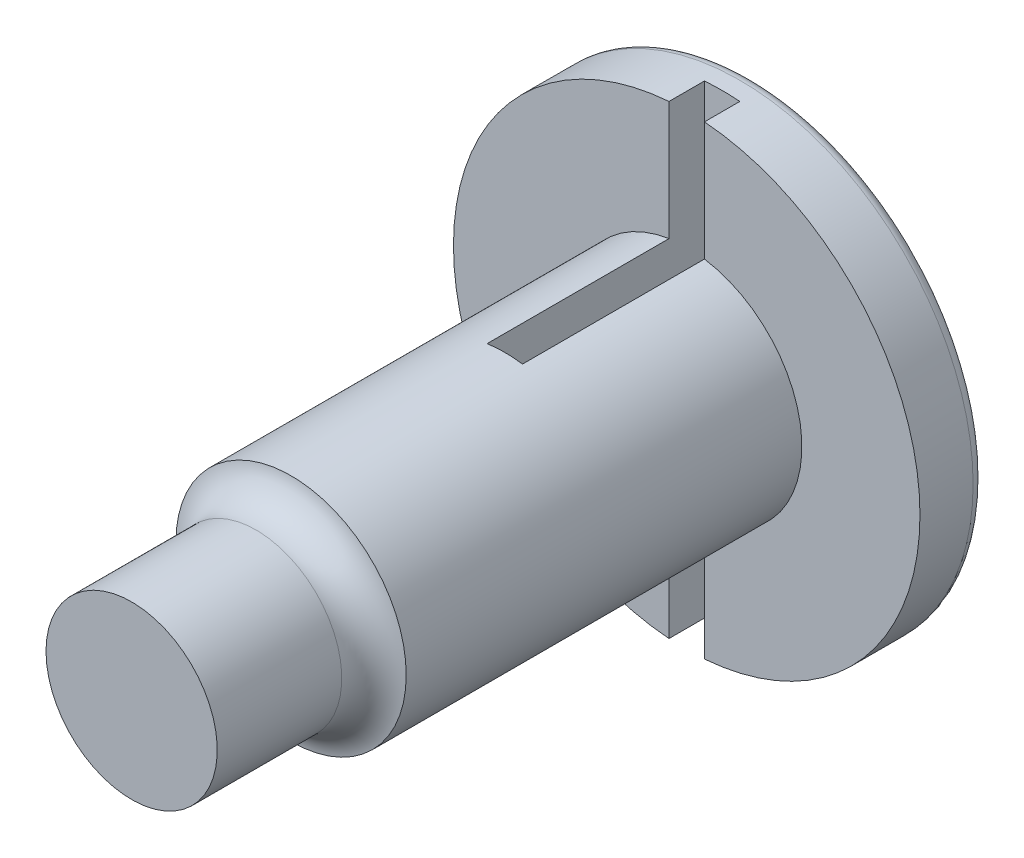
ISO-10303-21;
HEADER;
FILE_DESCRIPTION(('STEP AP214'),'2;1');
FILE_NAME('part.step','',(''),(''),'','','');
FILE_SCHEMA(('AUTOMOTIVE_DESIGN { 1 0 10303 214 1 1 1 1 }'));
ENDSEC;
DATA;
#1=APPLICATION_CONTEXT('core data for automotive mechanical design processes');
#2=APPLICATION_PROTOCOL_DEFINITION('international standard','automotive_design',2000,#1);
#3=PRODUCT_CONTEXT('',#1,'mechanical');
#4=PRODUCT('Part','Part','',(#3));
#5=PRODUCT_RELATED_PRODUCT_CATEGORY('part','',(#4));
#6=PRODUCT_DEFINITION_FORMATION('','',#4);
#7=PRODUCT_DEFINITION_CONTEXT('part definition',#1,'design');
#8=PRODUCT_DEFINITION('design','',#6,#7);
#9=PRODUCT_DEFINITION_SHAPE('','',#8);
#10=(LENGTH_UNIT() NAMED_UNIT(*) SI_UNIT(.MILLI.,.METRE.));
#11=(NAMED_UNIT(*) PLANE_ANGLE_UNIT() SI_UNIT($,.RADIAN.));
#12=(NAMED_UNIT(*) SI_UNIT($,.STERADIAN.) SOLID_ANGLE_UNIT());
#13=UNCERTAINTY_MEASURE_WITH_UNIT(LENGTH_MEASURE(1.E-05),#10,'distance_accuracy_value','');
#14=(GEOMETRIC_REPRESENTATION_CONTEXT(3) GLOBAL_UNCERTAINTY_ASSIGNED_CONTEXT((#13)) GLOBAL_UNIT_ASSIGNED_CONTEXT((#10,
#11,#12)) REPRESENTATION_CONTEXT('',''));
#15=CARTESIAN_POINT('',(0.,0.,0.));
#16=DIRECTION('',(0.,0.,1.));
#17=DIRECTION('',(1.,0.,0.));
#18=AXIS2_PLACEMENT_3D('',#15,#16,#17);
#19=CARTESIAN_POINT('',(15.,-197.5,-30.));
#20=DIRECTION('',(1.,0.,0.));
#21=DIRECTION('',(0.,0.,-1.));
#22=AXIS2_PLACEMENT_3D('',#19,#20,#21);
#23=PLANE('',#22);
#24=DIRECTION('',(0.,1.,0.));
#25=VECTOR('',#24,1.);
#26=CARTESIAN_POINT('',(15.,-197.5,-30.));
#27=LINE('',#26,#25);
#28=CARTESIAN_POINT('',(15.,55.5090082779363,-30.));
#29=VERTEX_POINT('',#28);
#30=CARTESIAN_POINT('',(15.,196.92955593308,-30.));
#31=VERTEX_POINT('',#30);
#32=EDGE_CURVE('E139',#29,#31,#27,.T.);
#33=ORIENTED_EDGE('',*,*,#32,.F.);
#34=DIRECTION('',(0.,0.,1.));
#35=VECTOR('',#34,1.);
#36=CARTESIAN_POINT('',(15.,55.5090082779363,-285.));
#37=LINE('',#36,#35);
#38=CARTESIAN_POINT('',(15.,55.5090082779361,152.312875344914));
#39=VERTEX_POINT('',#38);
#40=EDGE_CURVE('E124',#29,#39,#37,.T.);
#41=ORIENTED_EDGE('',*,*,#40,.T.);
#42=DIRECTION('',(0.,-0.999133073092352,-0.0416305447121813));
#43=VECTOR('',#42,1.);
#44=CARTESIAN_POINT('',(15.,-273.,138.625));
#45=LINE('',#44,#43);
#46=CARTESIAN_POINT('',(15.,96.3392443399885,154.014135180833));
#47=VERTEX_POINT('',#46);
#48=EDGE_CURVE('E136',#47,#39,#45,.T.);
#49=ORIENTED_EDGE('',*,*,#48,.F.);
#50=DIRECTION('',(0.,0.,-1.));
#51=VECTOR('',#50,1.);
#52=CARTESIAN_POINT('',(15.,96.3392443399885,335.));
#53=LINE('',#52,#51);
#54=CARTESIAN_POINT('',(15.,96.3392443399885,0.));
#55=VERTEX_POINT('',#54);
#56=EDGE_CURVE('E155',#55,#47,#53,.F.);
#57=ORIENTED_EDGE('',*,*,#56,.F.);
#58=DIRECTION('',(0.,1.,0.));
#59=VECTOR('',#58,1.);
#60=CARTESIAN_POINT('',(15.,-197.5,0.));
#61=LINE('',#60,#59);
#62=CARTESIAN_POINT('',(15.,196.92955593308,0.));
#63=VERTEX_POINT('',#62);
#64=EDGE_CURVE('E170',#55,#63,#61,.T.);
#65=ORIENTED_EDGE('',*,*,#64,.T.);
#66=DIRECTION('',(0.,0.,1.));
#67=VECTOR('',#66,1.);
#68=CARTESIAN_POINT('',(15.,196.92955593308,-55.));
#69=LINE('',#68,#67);
#70=EDGE_CURVE('E179',#63,#31,#69,.F.);
#71=ORIENTED_EDGE('',*,*,#70,.T.);
#72=EDGE_LOOP('',(#33,#41,#49,#57,#65,#71));
#73=FACE_BOUND('',#72,.T.);
#74=ADVANCED_FACE('F35',(#73),#23,.F.);
#75=CARTESIAN_POINT('',(-15.,197.5,-30.));
#76=DIRECTION('',(-1.,0.,0.));
#77=DIRECTION('',(0.,0.,1.));
#78=AXIS2_PLACEMENT_3D('',#75,#76,#77);
#79=PLANE('',#78);
#80=DIRECTION('',(0.,-1.,0.));
#81=VECTOR('',#80,1.);
#82=CARTESIAN_POINT('',(-15.,197.5,-30.));
#83=LINE('',#82,#81);
#84=CARTESIAN_POINT('',(-15.,-55.5090082779363,-30.));
#85=VERTEX_POINT('',#84);
#86=CARTESIAN_POINT('',(-15.,-196.92955593308,-30.));
#87=VERTEX_POINT('',#86);
#88=EDGE_CURVE('E163',#85,#87,#83,.T.);
#89=ORIENTED_EDGE('',*,*,#88,.F.);
#90=DIRECTION('',(0.,0.,1.));
#91=VECTOR('',#90,1.);
#92=CARTESIAN_POINT('',(-15.,-55.5090082779363,-285.));
#93=LINE('',#92,#91);
#94=CARTESIAN_POINT('',(-15.,-55.5090082779365,147.687124655086));
#95=VERTEX_POINT('',#94);
#96=EDGE_CURVE('E254',#85,#95,#93,.T.);
#97=ORIENTED_EDGE('',*,*,#96,.T.);
#98=DIRECTION('',(0.,-0.999133073092352,-0.0416305447121813));
#99=VECTOR('',#98,1.);
#100=CARTESIAN_POINT('',(-15.,-273.,138.625));
#101=LINE('',#100,#99);
#102=CARTESIAN_POINT('',(-15.,-96.3392443399885,145.985864819167));
#103=VERTEX_POINT('',#102);
#104=EDGE_CURVE('E251',#95,#103,#101,.T.);
#105=ORIENTED_EDGE('',*,*,#104,.T.);
#106=DIRECTION('',(0.,0.,-1.));
#107=VECTOR('',#106,1.);
#108=CARTESIAN_POINT('',(-15.,-96.3392443399885,335.));
#109=LINE('',#108,#107);
#110=CARTESIAN_POINT('',(-15.,-96.3392443399885,0.));
#111=VERTEX_POINT('',#110);
#112=EDGE_CURVE('E148',#103,#111,#109,.T.);
#113=ORIENTED_EDGE('',*,*,#112,.T.);
#114=DIRECTION('',(0.,-1.,0.));
#115=VECTOR('',#114,1.);
#116=CARTESIAN_POINT('',(-15.,197.5,0.));
#117=LINE('',#116,#115);
#118=CARTESIAN_POINT('',(-15.,-196.92955593308,0.));
#119=VERTEX_POINT('',#118);
#120=EDGE_CURVE('E159',#111,#119,#117,.T.);
#121=ORIENTED_EDGE('',*,*,#120,.T.);
#122=DIRECTION('',(0.,0.,1.));
#123=VECTOR('',#122,1.);
#124=CARTESIAN_POINT('',(-15.,-196.92955593308,-55.));
#125=LINE('',#124,#123);
#126=EDGE_CURVE('E174',#119,#87,#125,.F.);
#127=ORIENTED_EDGE('',*,*,#126,.T.);
#128=EDGE_LOOP('',(#89,#97,#105,#113,#121,#127));
#129=FACE_BOUND('',#128,.T.);
#130=ADVANCED_FACE('F218',(#129),#79,.F.);
#131=CARTESIAN_POINT('',(0.,0.,-30.));
#132=DIRECTION('',(0.,0.,1.));
#133=DIRECTION('',(1.,0.,0.));
#134=AXIS2_PLACEMENT_3D('',#131,#132,#133);
#135=PLANE('',#134);
#136=CARTESIAN_POINT('',(0.,0.,-30.));
#137=DIRECTION('',(0.,0.,1.));
#138=DIRECTION('',(1.,0.,0.));
#139=AXIS2_PLACEMENT_3D('',#136,#137,#138);
#140=CIRCLE('',#139,57.5);
#141=CARTESIAN_POINT('',(-15.,55.5090082779363,-30.));
#142=VERTEX_POINT('',#141);
#143=EDGE_CURVE('E140',#29,#142,#140,.T.);
#144=ORIENTED_EDGE('',*,*,#143,.F.);
#145=ORIENTED_EDGE('',*,*,#32,.T.);
#146=CARTESIAN_POINT('',(0.,0.,-30.));
#147=DIRECTION('',(0.,0.,1.));
#148=DIRECTION('',(1.,0.,0.));
#149=AXIS2_PLACEMENT_3D('',#146,#147,#148);
#150=CIRCLE('',#149,197.5);
#151=CARTESIAN_POINT('',(-15.,196.92955593308,-30.));
#152=VERTEX_POINT('',#151);
#153=EDGE_CURVE('E195',#152,#31,#150,.F.);
#154=ORIENTED_EDGE('',*,*,#153,.F.);
#155=EDGE_CURVE('E160',#152,#142,#83,.T.);
#156=ORIENTED_EDGE('',*,*,#155,.T.);
#157=EDGE_LOOP('',(#144,#145,#154,#156));
#158=FACE_BOUND('',#157,.T.);
#159=ADVANCED_FACE('F224',(#158),#135,.T.);
#160=CARTESIAN_POINT('',(15.,-273.,138.625));
#161=DIRECTION('',(0.,0.0416305447121813,-0.999133073092352));
#162=DIRECTION('',(0.,0.999133073092352,0.0416305447121813));
#163=AXIS2_PLACEMENT_3D('',#160,#161,#162);
#164=PLANE('',#163);
#165=CARTESIAN_POINT('',(0.,0.,150.));
#166=DIRECTION('',(0.,0.0416305447121813,-0.999133073092352));
#167=DIRECTION('',(0.,0.999133073092352,0.0416305447121813));
#168=AXIS2_PLACEMENT_3D('',#165,#166,#167);
#169=ELLIPSE('',#168,57.5498915495165,57.5);
#170=CARTESIAN_POINT('',(15.,-55.5090082779365,147.687124655086));
#171=VERTEX_POINT('',#170);
#172=EDGE_CURVE('E130',#171,#95,#169,.T.);
#173=ORIENTED_EDGE('',*,*,#172,.F.);
#174=CARTESIAN_POINT('',(15.,-96.3392443399885,145.985864819167));
#175=VERTEX_POINT('',#174);
#176=EDGE_CURVE('E146',#171,#175,#45,.T.);
#177=ORIENTED_EDGE('',*,*,#176,.T.);
#178=CARTESIAN_POINT('',(0.,0.,150.));
#179=DIRECTION('',(0.,0.0416305447121813,-0.999133073092352));
#180=DIRECTION('',(0.,-0.999133073092352,-0.0416305447121813));
#181=AXIS2_PLACEMENT_3D('',#178,#179,#180);
#182=ELLIPSE('',#181,97.5845987143976,97.5);
#183=EDGE_CURVE('E131',#175,#103,#182,.T.);
#184=ORIENTED_EDGE('',*,*,#183,.T.);
#185=ORIENTED_EDGE('',*,*,#104,.F.);
#186=EDGE_LOOP('',(#173,#177,#184,#185));
#187=FACE_BOUND('',#186,.T.);
#188=ADVANCED_FACE('F248',(#187),#164,.T.);
#189=CARTESIAN_POINT('',(0.,0.,0.));
#190=DIRECTION('',(0.,0.,1.));
#191=DIRECTION('',(1.,0.,0.));
#192=AXIS2_PLACEMENT_3D('',#189,#190,#191);
#193=PLANE('',#192);
#194=CARTESIAN_POINT('',(15.,-196.92955593308,0.));
#195=VERTEX_POINT('',#194);
#196=CARTESIAN_POINT('',(15.,-96.3392443399885,0.));
#197=VERTEX_POINT('',#196);
#198=EDGE_CURVE('E172',#195,#197,#61,.T.);
#199=ORIENTED_EDGE('',*,*,#198,.F.);
#200=CARTESIAN_POINT('',(0.,0.,0.));
#201=DIRECTION('',(0.,0.,1.));
#202=DIRECTION('',(1.,0.,0.));
#203=AXIS2_PLACEMENT_3D('',#200,#201,#202);
#204=CIRCLE('',#203,197.5);
#205=EDGE_CURVE('E187',#195,#63,#204,.T.);
#206=ORIENTED_EDGE('',*,*,#205,.T.);
#207=ORIENTED_EDGE('',*,*,#64,.F.);
#208=CARTESIAN_POINT('',(0.,0.,0.));
#209=DIRECTION('',(0.,0.,1.));
#210=DIRECTION('',(1.,0.,0.));
#211=AXIS2_PLACEMENT_3D('',#208,#209,#210);
#212=CIRCLE('',#211,97.5);
#213=EDGE_CURVE('E188',#197,#55,#212,.T.);
#214=ORIENTED_EDGE('',*,*,#213,.F.);
#215=EDGE_LOOP('',(#199,#206,#207,#214));
#216=FACE_BOUND('',#215,.T.);
#217=ADVANCED_FACE('F274',(#216),#193,.T.);
#218=CARTESIAN_POINT('',(0.,0.,-55.));
#219=DIRECTION('',(0.,0.,1.));
#220=DIRECTION('',(1.,0.,0.));
#221=AXIS2_PLACEMENT_3D('',#218,#219,#220);
#222=CYLINDRICAL_SURFACE('',#221,197.5);
#223=CARTESIAN_POINT('',(0.,0.,-45.));
#224=DIRECTION('',(0.,0.,1.));
#225=DIRECTION('',(1.,0.,0.));
#226=AXIS2_PLACEMENT_3D('',#223,#224,#225);
#227=CIRCLE('',#226,197.5);
#228=CARTESIAN_POINT('',(197.5,0.,-45.));
#229=VERTEX_POINT('',#228);
#230=EDGE_CURVE('E43',#229,#229,#227,.T.);
#231=ORIENTED_EDGE('',*,*,#230,.T.);
#232=EDGE_LOOP('',(#231));
#233=FACE_BOUND('',#232,.T.);
#234=DIRECTION('',(0.,0.,1.));
#235=VECTOR('',#234,1.);
#236=CARTESIAN_POINT('',(15.,-196.92955593308,-55.));
#237=LINE('',#236,#235);
#238=CARTESIAN_POINT('',(15.,-196.92955593308,-30.));
#239=VERTEX_POINT('',#238);
#240=EDGE_CURVE('E177',#239,#195,#237,.T.);
#241=ORIENTED_EDGE('',*,*,#240,.F.);
#242=EDGE_CURVE('E198',#239,#87,#150,.F.);
#243=ORIENTED_EDGE('',*,*,#242,.T.);
#244=ORIENTED_EDGE('',*,*,#126,.F.);
#245=CARTESIAN_POINT('',(-15.,196.92955593308,0.));
#246=VERTEX_POINT('',#245);
#247=EDGE_CURVE('E192',#246,#119,#204,.T.);
#248=ORIENTED_EDGE('',*,*,#247,.F.);
#249=DIRECTION('',(0.,0.,1.));
#250=VECTOR('',#249,1.);
#251=CARTESIAN_POINT('',(-15.,196.92955593308,-55.));
#252=LINE('',#251,#250);
#253=EDGE_CURVE('E167',#152,#246,#252,.T.);
#254=ORIENTED_EDGE('',*,*,#253,.F.);
#255=ORIENTED_EDGE('',*,*,#153,.T.);
#256=ORIENTED_EDGE('',*,*,#70,.F.);
#257=ORIENTED_EDGE('',*,*,#205,.F.);
#258=EDGE_LOOP('',(#241,#243,#244,#248,#254,#255,#256,#257));
#259=FACE_BOUND('',#258,.T.);
#260=ADVANCED_FACE('F205',(#233,#259),#222,.T.);
#261=CARTESIAN_POINT('',(0.,0.,-55.));
#262=DIRECTION('',(0.,0.,1.));
#263=DIRECTION('',(1.,0.,0.));
#264=AXIS2_PLACEMENT_3D('',#261,#262,#263);
#265=PLANE('',#264);
#266=CARTESIAN_POINT('',(0.,0.,-55.));
#267=DIRECTION('',(0.,0.,1.));
#268=DIRECTION('',(1.,0.,0.));
#269=AXIS2_PLACEMENT_3D('',#266,#267,#268);
#270=CIRCLE('',#269,187.5);
#271=CARTESIAN_POINT('',(187.5,0.,-55.));
#272=VERTEX_POINT('',#271);
#273=EDGE_CURVE('E11',#272,#272,#270,.F.);
#274=ORIENTED_EDGE('',*,*,#273,.T.);
#275=EDGE_LOOP('',(#274));
#276=FACE_BOUND('',#275,.T.);
#277=CARTESIAN_POINT('',(0.,0.,-55.));
#278=DIRECTION('',(0.,0.,1.));
#279=DIRECTION('',(1.,0.,0.));
#280=AXIS2_PLACEMENT_3D('',#277,#278,#279);
#281=CIRCLE('',#280,57.5);
#282=CARTESIAN_POINT('',(57.5,0.,-55.));
#283=VERTEX_POINT('',#282);
#284=EDGE_CURVE('E261',#283,#283,#281,.T.);
#285=ORIENTED_EDGE('',*,*,#284,.T.);
#286=EDGE_LOOP('',(#285));
#287=FACE_BOUND('',#286,.T.);
#288=ADVANCED_FACE('F333',(#276,#287),#265,.F.);
#289=CARTESIAN_POINT('',(-15.,96.3392443399885,0.));
#290=VERTEX_POINT('',#289);
#291=EDGE_CURVE('E169',#246,#290,#117,.T.);
#292=ORIENTED_EDGE('',*,*,#291,.F.);
#293=ORIENTED_EDGE('',*,*,#247,.T.);
#294=ORIENTED_EDGE('',*,*,#120,.F.);
#295=EDGE_CURVE('E191',#290,#111,#212,.T.);
#296=ORIENTED_EDGE('',*,*,#295,.F.);
#297=EDGE_LOOP('',(#292,#293,#294,#296));
#298=FACE_BOUND('',#297,.T.);
#299=ADVANCED_FACE('F284',(#298),#193,.T.);
#300=CARTESIAN_POINT('',(0.,0.,335.));
#301=DIRECTION('',(0.,0.,-1.));
#302=DIRECTION('',(-1.,0.,0.));
#303=AXIS2_PLACEMENT_3D('',#300,#301,#302);
#304=CYLINDRICAL_SURFACE('',#303,97.5);
#305=CARTESIAN_POINT('',(0.,0.,335.));
#306=DIRECTION('',(0.,0.,1.));
#307=DIRECTION('',(1.,0.,0.));
#308=AXIS2_PLACEMENT_3D('',#305,#306,#307);
#309=CIRCLE('',#308,97.5);
#310=CARTESIAN_POINT('',(97.5,0.,335.));
#311=VERTEX_POINT('',#310);
#312=EDGE_CURVE('E184',#311,#311,#309,.T.);
#313=ORIENTED_EDGE('',*,*,#312,.F.);
#314=EDGE_LOOP('',(#313));
#315=FACE_BOUND('',#314,.T.);
#316=ORIENTED_EDGE('',*,*,#183,.F.);
#317=DIRECTION('',(0.,0.,-1.));
#318=VECTOR('',#317,1.);
#319=CARTESIAN_POINT('',(15.,-96.3392443399885,335.));
#320=LINE('',#319,#318);
#321=EDGE_CURVE('E157',#175,#197,#320,.T.);
#322=ORIENTED_EDGE('',*,*,#321,.T.);
#323=ORIENTED_EDGE('',*,*,#213,.T.);
#324=ORIENTED_EDGE('',*,*,#56,.T.);
#325=CARTESIAN_POINT('',(-15.,96.3392443399885,154.014135180833));
#326=VERTEX_POINT('',#325);
#327=EDGE_CURVE('E144',#326,#47,#182,.T.);
#328=ORIENTED_EDGE('',*,*,#327,.F.);
#329=DIRECTION('',(0.,0.,-1.));
#330=VECTOR('',#329,1.);
#331=CARTESIAN_POINT('',(-15.,96.3392443399885,335.));
#332=LINE('',#331,#330);
#333=EDGE_CURVE('E145',#290,#326,#332,.F.);
#334=ORIENTED_EDGE('',*,*,#333,.F.);
#335=ORIENTED_EDGE('',*,*,#295,.T.);
#336=ORIENTED_EDGE('',*,*,#112,.F.);
#337=EDGE_LOOP('',(#316,#322,#323,#324,#328,#334,#335,#336));
#338=FACE_BOUND('',#337,.T.);
#339=ADVANCED_FACE('F277',(#315,#338),#304,.T.);
#340=CARTESIAN_POINT('',(0.,0.,470.));
#341=DIRECTION('',(0.,0.,-1.));
#342=DIRECTION('',(-1.,0.,0.));
#343=AXIS2_PLACEMENT_3D('',#340,#341,#342);
#344=CYLINDRICAL_SURFACE('',#343,72.5);
#345=CARTESIAN_POINT('',(0.,0.,364.580398915498));
#346=DIRECTION('',(0.,0.,-1.));
#347=DIRECTION('',(-1.,0.,0.));
#348=AXIS2_PLACEMENT_3D('',#345,#346,#347);
#349=CIRCLE('',#348,72.5);
#350=CARTESIAN_POINT('',(-72.5,0.,364.580398915498));
#351=VERTEX_POINT('',#350);
#352=EDGE_CURVE('E200',#351,#351,#349,.F.);
#353=CARTESIAN_POINT('',(0.,0.,470.));
#354=DIRECTION('',(0.,0.,1.));
#355=DIRECTION('',(1.,0.,0.));
#356=AXIS2_PLACEMENT_3D('',#353,#354,#355);
#357=CIRCLE('',#356,72.5);
#358=CARTESIAN_POINT('',(-72.5,0.,470.));
#359=VERTEX_POINT('',#358);
#360=EDGE_CURVE('E181',#359,#359,#357,.T.);
#361=CARTESIAN_POINT('',(-72.5,0.,364.580398915498));
#362=CARTESIAN_POINT('',(-72.5,0.,365.678519760128));
#363=CARTESIAN_POINT('',(-72.5,0.,366.776640604758));
#364=CARTESIAN_POINT('',(-72.5,0.,368.972882294019));
#365=CARTESIAN_POINT('',(-72.5,0.,370.071003138649));
#366=CARTESIAN_POINT('',(-72.5,0.,372.26724482791));
#367=CARTESIAN_POINT('',(-72.5,0.,373.36536567254));
#368=CARTESIAN_POINT('',(-72.5,0.,375.5616073618));
#369=CARTESIAN_POINT('',(-72.5,0.,376.659728206431));
#370=CARTESIAN_POINT('',(-72.5,0.,378.855969895691));
#371=CARTESIAN_POINT('',(-72.5,0.,379.954090740321));
#372=CARTESIAN_POINT('',(-72.5,0.,382.150332429582));
#373=CARTESIAN_POINT('',(-72.5,0.,383.248453274212));
#374=CARTESIAN_POINT('',(-72.5,0.,385.444694963472));
#375=CARTESIAN_POINT('',(-72.5,0.,386.542815808103));
#376=CARTESIAN_POINT('',(-72.5,0.,388.739057497363));
#377=CARTESIAN_POINT('',(-72.5,0.,389.837178341993));
#378=CARTESIAN_POINT('',(-72.5,0.,392.033420031254));
#379=CARTESIAN_POINT('',(-72.5,0.,393.131540875884));
#380=CARTESIAN_POINT('',(-72.5,0.,395.327782565144));
#381=CARTESIAN_POINT('',(-72.5,0.,396.425903409775));
#382=CARTESIAN_POINT('',(-72.5,0.,398.622145099035));
#383=CARTESIAN_POINT('',(-72.5,0.,399.720265943665));
#384=CARTESIAN_POINT('',(-72.5,0.,401.916507632926));
#385=CARTESIAN_POINT('',(-72.5,0.,403.014628477556));
#386=CARTESIAN_POINT('',(-72.5,0.,405.210870166817));
#387=CARTESIAN_POINT('',(-72.5,0.,406.308991011447));
#388=CARTESIAN_POINT('',(-72.5,0.,408.505232700707));
#389=CARTESIAN_POINT('',(-72.5,0.,409.603353545337));
#390=CARTESIAN_POINT('',(-72.5,0.,411.799595234598));
#391=CARTESIAN_POINT('',(-72.5,0.,412.897716079228));
#392=CARTESIAN_POINT('',(-72.5,0.,415.093957768489));
#393=CARTESIAN_POINT('',(-72.5,0.,416.192078613119));
#394=CARTESIAN_POINT('',(-72.5,0.,418.388320302379));
#395=CARTESIAN_POINT('',(-72.5,0.,419.486441147009));
#396=CARTESIAN_POINT('',(-72.5,0.,421.68268283627));
#397=CARTESIAN_POINT('',(-72.5,0.,422.7808036809));
#398=CARTESIAN_POINT('',(-72.5,0.,424.977045370161));
#399=CARTESIAN_POINT('',(-72.5,0.,426.075166214791));
#400=CARTESIAN_POINT('',(-72.5,0.,428.271407904051));
#401=CARTESIAN_POINT('',(-72.5,0.,429.369528748681));
#402=CARTESIAN_POINT('',(-72.5,0.,431.565770437942));
#403=CARTESIAN_POINT('',(-72.5,0.,432.663891282572));
#404=CARTESIAN_POINT('',(-72.5,0.,434.860132971833));
#405=CARTESIAN_POINT('',(-72.5,0.,435.958253816463));
#406=CARTESIAN_POINT('',(-72.5,0.,438.154495505723));
#407=CARTESIAN_POINT('',(-72.5,0.,439.252616350354));
#408=CARTESIAN_POINT('',(-72.5,0.,441.448858039614));
#409=CARTESIAN_POINT('',(-72.5,0.,442.546978884244));
#410=CARTESIAN_POINT('',(-72.5,0.,444.743220573505));
#411=CARTESIAN_POINT('',(-72.5,0.,445.841341418135));
#412=CARTESIAN_POINT('',(-72.5,0.,448.037583107395));
#413=CARTESIAN_POINT('',(-72.5,0.,449.135703952026));
#414=CARTESIAN_POINT('',(-72.5,0.,451.331945641286));
#415=CARTESIAN_POINT('',(-72.5,0.,452.430066485916));
#416=CARTESIAN_POINT('',(-72.5,0.,454.626308175177));
#417=CARTESIAN_POINT('',(-72.5,0.,455.724429019807));
#418=CARTESIAN_POINT('',(-72.5,0.,457.920670709067));
#419=CARTESIAN_POINT('',(-72.5,0.,459.018791553698));
#420=CARTESIAN_POINT('',(-72.5,0.,461.215033242958));
#421=CARTESIAN_POINT('',(-72.5,0.,462.313154087588));
#422=CARTESIAN_POINT('',(-72.5,0.,464.509395776849));
#423=CARTESIAN_POINT('',(-72.5,0.,465.607516621479));
#424=CARTESIAN_POINT('',(-72.5,0.,467.80375831074));
#425=CARTESIAN_POINT('',(-72.5,0.,468.90187915537));
#426=CARTESIAN_POINT('',(-72.5,0.,470.));
#427=B_SPLINE_CURVE_WITH_KNOTS('',3,(#361,#362,#363,#364,#365,#366,#367,#368,#369,#370,#371,
#372,#373,#374,#375,#376,#377,#378,#379,#380,#381,#382,#383,#384,#385,#386,#387,#388,#389,#390,
#391,#392,#393,#394,#395,#396,#397,#398,#399,#400,#401,#402,#403,#404,#405,#406,#407,#408,#409,
#410,#411,#412,#413,#414,#415,#416,#417,#418,#419,#420,#421,#422,#423,#424,#425,#426),
.UNSPECIFIED.,.F.,.F.,(4,2,2,2,2,2,2,2,2,2,2,2,2,2,2,2,2,2,2,2,2,2,2,2,2,2,2,2,2,2,2,2,4),(0.,
3.2943625338907,6.58872506778135,9.88308760167206,13.1774501355628,16.4718126694535,
19.7661752033441,23.0605377372348,26.3549002711255,29.6492628050162,32.9436253389069,
36.2379878727975,39.5323504066882,42.8267129405789,46.1210754744696,49.4154380083603,
52.7098005422509,56.0041630761416,59.2985256100323,62.592888143923,65.8872506778137,
69.1816132117044,72.4759757455951,75.7703382794858,79.0647008133765,82.3590633472671,
85.6534258811578,88.9477884150485,92.2421509489392,95.5365134828299,98.8308760167205,
102.125238550611,105.419601084502),.UNSPECIFIED.);
#428=EDGE_CURVE('BSEAM238',#351,#359,#427,.T.);
#429=ORIENTED_EDGE('',*,*,#352,.T.);
#430=ORIENTED_EDGE('',*,*,#360,.F.);
#431=ORIENTED_EDGE('',*,*,#428,.T.);
#432=ORIENTED_EDGE('',*,*,#428,.F.);
#433=EDGE_LOOP('',(#429,#431,#430,#432));
#434=FACE_BOUND('',#433,.T.);
#435=ADVANCED_FACE('F238',(#434),#344,.T.);
#436=CARTESIAN_POINT('',(0.,0.,470.));
#437=DIRECTION('',(0.,0.,1.));
#438=DIRECTION('',(1.,0.,0.));
#439=AXIS2_PLACEMENT_3D('',#436,#437,#438);
#440=PLANE('',#439);
#441=ORIENTED_EDGE('',*,*,#360,.T.);
#442=EDGE_LOOP('',(#441));
#443=FACE_BOUND('',#442,.T.);
#444=ADVANCED_FACE('F230',(#443),#440,.T.);
#445=ORIENTED_EDGE('',*,*,#176,.F.);
#446=DIRECTION('',(0.,0.,1.));
#447=VECTOR('',#446,1.);
#448=CARTESIAN_POINT('',(15.,-55.5090082779363,-285.));
#449=LINE('',#448,#447);
#450=CARTESIAN_POINT('',(15.,-55.5090082779363,-30.));
#451=VERTEX_POINT('',#450);
#452=EDGE_CURVE('E58',#171,#451,#449,.F.);
#453=ORIENTED_EDGE('',*,*,#452,.T.);
#454=EDGE_CURVE('E164',#239,#451,#27,.T.);
#455=ORIENTED_EDGE('',*,*,#454,.F.);
#456=ORIENTED_EDGE('',*,*,#240,.T.);
#457=ORIENTED_EDGE('',*,*,#198,.T.);
#458=ORIENTED_EDGE('',*,*,#321,.F.);
#459=EDGE_LOOP('',(#445,#453,#455,#456,#457,#458));
#460=FACE_BOUND('',#459,.T.);
#461=ADVANCED_FACE('F220',(#460),#23,.F.);
#462=CARTESIAN_POINT('',(-15.,55.5090082779361,152.312875344914));
#463=VERTEX_POINT('',#462);
#464=EDGE_CURVE('E150',#326,#463,#101,.T.);
#465=ORIENTED_EDGE('',*,*,#464,.T.);
#466=DIRECTION('',(0.,0.,1.));
#467=VECTOR('',#466,1.);
#468=CARTESIAN_POINT('',(-15.,55.5090082779363,-285.));
#469=LINE('',#468,#467);
#470=EDGE_CURVE('E50',#463,#142,#469,.F.);
#471=ORIENTED_EDGE('',*,*,#470,.T.);
#472=ORIENTED_EDGE('',*,*,#155,.F.);
#473=ORIENTED_EDGE('',*,*,#253,.T.);
#474=ORIENTED_EDGE('',*,*,#291,.T.);
#475=ORIENTED_EDGE('',*,*,#333,.T.);
#476=EDGE_LOOP('',(#465,#471,#472,#473,#474,#475));
#477=FACE_BOUND('',#476,.T.);
#478=ADVANCED_FACE('F227',(#477),#79,.F.);
#479=EDGE_CURVE('E258',#85,#451,#140,.T.);
#480=ORIENTED_EDGE('',*,*,#479,.F.);
#481=ORIENTED_EDGE('',*,*,#88,.T.);
#482=ORIENTED_EDGE('',*,*,#242,.F.);
#483=ORIENTED_EDGE('',*,*,#454,.T.);
#484=EDGE_LOOP('',(#480,#481,#482,#483));
#485=FACE_BOUND('',#484,.T.);
#486=ADVANCED_FACE('F236',(#485),#135,.T.);
#487=EDGE_CURVE('E121',#463,#39,#169,.T.);
#488=ORIENTED_EDGE('',*,*,#487,.F.);
#489=ORIENTED_EDGE('',*,*,#464,.F.);
#490=ORIENTED_EDGE('',*,*,#327,.T.);
#491=ORIENTED_EDGE('',*,*,#48,.T.);
#492=EDGE_LOOP('',(#488,#489,#490,#491));
#493=FACE_BOUND('',#492,.T.);
#494=ADVANCED_FACE('F142',(#493),#164,.T.);
#495=CARTESIAN_POINT('',(0.,0.,-285.));
#496=DIRECTION('',(0.,0.,1.));
#497=DIRECTION('',(1.,0.,0.));
#498=AXIS2_PLACEMENT_3D('',#495,#496,#497);
#499=CYLINDRICAL_SURFACE('',#498,57.5);
#500=CARTESIAN_POINT('',(0.,0.,235.));
#501=DIRECTION('',(0.,0.,1.));
#502=DIRECTION('',(1.,0.,0.));
#503=AXIS2_PLACEMENT_3D('',#500,#501,#502);
#504=CIRCLE('',#503,57.5);
#505=CARTESIAN_POINT('',(57.5,0.,235.));
#506=VERTEX_POINT('',#505);
#507=EDGE_CURVE('E311',#506,#506,#504,.T.);
#508=ORIENTED_EDGE('',*,*,#507,.T.);
#509=EDGE_LOOP('',(#508));
#510=FACE_BOUND('',#509,.T.);
#511=ORIENTED_EDGE('',*,*,#143,.T.);
#512=ORIENTED_EDGE('',*,*,#470,.F.);
#513=ORIENTED_EDGE('',*,*,#487,.T.);
#514=ORIENTED_EDGE('',*,*,#40,.F.);
#515=EDGE_LOOP('',(#511,#512,#513,#514));
#516=FACE_BOUND('',#515,.T.);
#517=ORIENTED_EDGE('',*,*,#479,.T.);
#518=ORIENTED_EDGE('',*,*,#452,.F.);
#519=ORIENTED_EDGE('',*,*,#172,.T.);
#520=ORIENTED_EDGE('',*,*,#96,.F.);
#521=EDGE_LOOP('',(#517,#518,#519,#520));
#522=FACE_BOUND('',#521,.T.);
#523=ORIENTED_EDGE('',*,*,#284,.F.);
#524=EDGE_LOOP('',(#523));
#525=FACE_BOUND('',#524,.T.);
#526=ADVANCED_FACE('F123',(#510,#516,#522,#525),#499,.F.);
#527=CARTESIAN_POINT('',(0.,0.,235.));
#528=DIRECTION('',(0.,0.,1.));
#529=DIRECTION('',(1.,0.,0.));
#530=AXIS2_PLACEMENT_3D('',#527,#528,#529);
#531=PLANE('',#530);
#532=ORIENTED_EDGE('',*,*,#507,.F.);
#533=EDGE_LOOP('',(#532));
#534=FACE_BOUND('',#533,.T.);
#535=ADVANCED_FACE('F214',(#534),#531,.F.);
#536=CARTESIAN_POINT('',(0.,0.,364.580398915498));
#537=DIRECTION('',(0.,0.,-1.));
#538=DIRECTION('',(-1.,0.,0.));
#539=AXIS2_PLACEMENT_3D('',#536,#537,#538);
#540=TOROIDAL_SURFACE('',#539,102.5,30.);
#541=ORIENTED_EDGE('',*,*,#352,.F.);
#542=EDGE_LOOP('',(#541));
#543=FACE_BOUND('',#542,.T.);
#544=ORIENTED_EDGE('',*,*,#312,.T.);
#545=EDGE_LOOP('',(#544));
#546=FACE_BOUND('',#545,.T.);
#547=ADVANCED_FACE('F209',(#543,#546),#540,.F.);
#548=CARTESIAN_POINT('',(0.,0.,-45.));
#549=DIRECTION('',(0.,0.,1.));
#550=DIRECTION('',(1.,0.,0.));
#551=AXIS2_PLACEMENT_3D('',#548,#549,#550);
#552=TOROIDAL_SURFACE('',#551,187.5,10.);
#553=ORIENTED_EDGE('',*,*,#273,.F.);
#554=EDGE_LOOP('',(#553));
#555=FACE_BOUND('',#554,.T.);
#556=ORIENTED_EDGE('',*,*,#230,.F.);
#557=EDGE_LOOP('',(#556));
#558=FACE_BOUND('',#557,.T.);
#559=ADVANCED_FACE('F37',(#555,#558),#552,.T.);
#560=CLOSED_SHELL('',(#74,#130,#159,#188,#217,#260,#288,#299,#339,#435,#444,#461,#478,#486,#494,
#526,#535,#547,#559));
#561=MANIFOLD_SOLID_BREP('B2',#560);
#562=ADVANCED_BREP_SHAPE_REPRESENTATION('',(#18,#561),#14);
#563=SHAPE_DEFINITION_REPRESENTATION(#9,#562);
ENDSEC;
END-ISO-10303-21;
